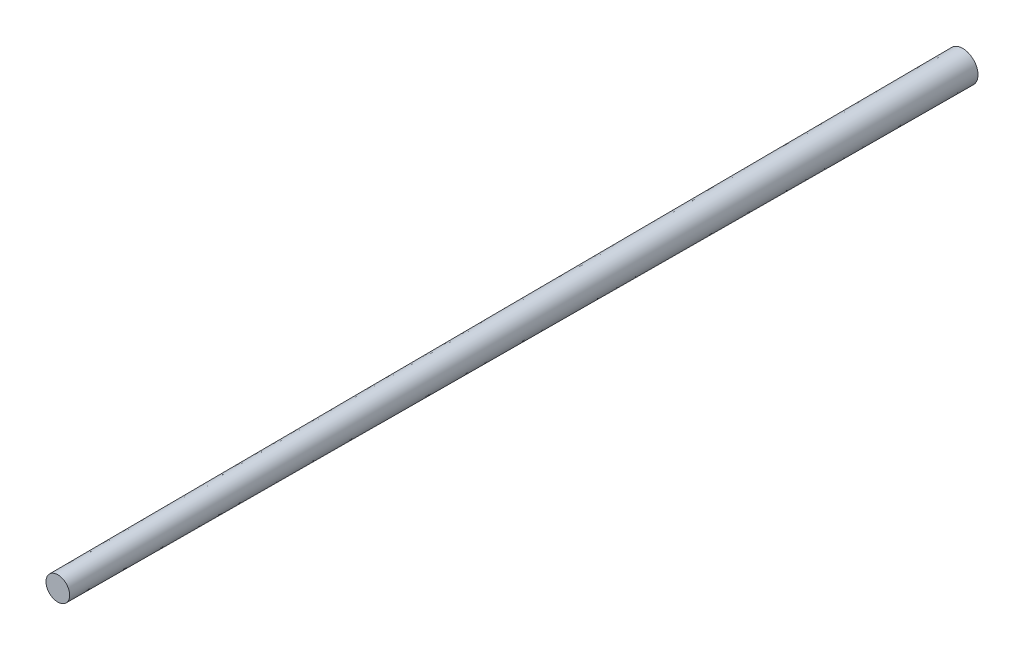
ISO-10303-21;
HEADER;
FILE_DESCRIPTION(('STEP AP214'),'2;1');
FILE_NAME('part.step','',(''),(''),'','','');
FILE_SCHEMA(('AUTOMOTIVE_DESIGN { 1 0 10303 214 1 1 1 1 }'));
ENDSEC;
DATA;
#1=APPLICATION_CONTEXT('core data for automotive mechanical design processes');
#2=APPLICATION_PROTOCOL_DEFINITION('international standard','automotive_design',2000,#1);
#3=PRODUCT_CONTEXT('',#1,'mechanical');
#4=PRODUCT('Part','Part','',(#3));
#5=PRODUCT_RELATED_PRODUCT_CATEGORY('part','',(#4));
#6=PRODUCT_DEFINITION_FORMATION('','',#4);
#7=PRODUCT_DEFINITION_CONTEXT('part definition',#1,'design');
#8=PRODUCT_DEFINITION('design','',#6,#7);
#9=PRODUCT_DEFINITION_SHAPE('','',#8);
#10=(LENGTH_UNIT() NAMED_UNIT(*) SI_UNIT(.MILLI.,.METRE.));
#11=(NAMED_UNIT(*) PLANE_ANGLE_UNIT() SI_UNIT($,.RADIAN.));
#12=(NAMED_UNIT(*) SI_UNIT($,.STERADIAN.) SOLID_ANGLE_UNIT());
#13=UNCERTAINTY_MEASURE_WITH_UNIT(LENGTH_MEASURE(1.E-05),#10,'distance_accuracy_value','');
#14=(GEOMETRIC_REPRESENTATION_CONTEXT(3) GLOBAL_UNCERTAINTY_ASSIGNED_CONTEXT((#13)) GLOBAL_UNIT_ASSIGNED_CONTEXT((#10,
#11,#12)) REPRESENTATION_CONTEXT('',''));
#15=CARTESIAN_POINT('',(0.,0.,0.));
#16=DIRECTION('',(0.,0.,1.));
#17=DIRECTION('',(1.,0.,0.));
#18=AXIS2_PLACEMENT_3D('',#15,#16,#17);
#19=CARTESIAN_POINT('',(0.,0.,0.));
#20=DIRECTION('',(0.,0.,-1.));
#21=DIRECTION('',(1.,0.,0.));
#22=AXIS2_PLACEMENT_3D('',#19,#20,#21);
#23=CONICAL_SURFACE('',#22,22.,0.00383972435438752);
#24=CARTESIAN_POINT('',(0.,0.,1300.));
#25=DIRECTION('',(0.,0.,1.));
#26=DIRECTION('',(1.,0.,0.));
#27=AXIS2_PLACEMENT_3D('',#24,#25,#26);
#28=CIRCLE('',#27,17.0083338077567);
#29=CARTESIAN_POINT('',(17.0083338077567,0.,1300.));
#30=VERTEX_POINT('',#29);
#31=EDGE_CURVE('E10',#30,#30,#28,.T.);
#32=ORIENTED_EDGE('',*,*,#31,.F.);
#33=EDGE_LOOP('',(#32));
#34=FACE_BOUND('',#33,.T.);
#35=CARTESIAN_POINT('',(0.,0.,0.));
#36=DIRECTION('',(0.,0.,1.));
#37=DIRECTION('',(1.,0.,0.));
#38=AXIS2_PLACEMENT_3D('',#35,#36,#37);
#39=CIRCLE('',#38,22.);
#40=CARTESIAN_POINT('',(22.,0.,0.));
#41=VERTEX_POINT('',#40);
#42=EDGE_CURVE('E44',#41,#41,#39,.T.);
#43=ORIENTED_EDGE('',*,*,#42,.T.);
#44=EDGE_LOOP('',(#43));
#45=FACE_BOUND('',#44,.T.);
#46=ADVANCED_FACE('F39',(#34,#45),#23,.T.);
#47=CARTESIAN_POINT('',(0.,0.,1300.));
#48=DIRECTION('',(0.,0.,1.));
#49=DIRECTION('',(1.,0.,0.));
#50=AXIS2_PLACEMENT_3D('',#47,#48,#49);
#51=PLANE('',#50);
#52=ORIENTED_EDGE('',*,*,#31,.T.);
#53=EDGE_LOOP('',(#52));
#54=FACE_BOUND('',#53,.T.);
#55=ADVANCED_FACE('F53',(#54),#51,.T.);
#56=CARTESIAN_POINT('',(0.,0.,0.));
#57=DIRECTION('',(0.,0.,1.));
#58=DIRECTION('',(1.,0.,0.));
#59=AXIS2_PLACEMENT_3D('',#56,#57,#58);
#60=PLANE('',#59);
#61=ORIENTED_EDGE('',*,*,#42,.F.);
#62=EDGE_LOOP('',(#61));
#63=FACE_BOUND('',#62,.T.);
#64=ADVANCED_FACE('F55',(#63),#60,.F.);
#65=CLOSED_SHELL('',(#46,#55,#64));
#66=MANIFOLD_SOLID_BREP('B2',#65);
#67=ADVANCED_BREP_SHAPE_REPRESENTATION('',(#18,#66),#14);
#68=SHAPE_DEFINITION_REPRESENTATION(#9,#67);
ENDSEC;
END-ISO-10303-21;
